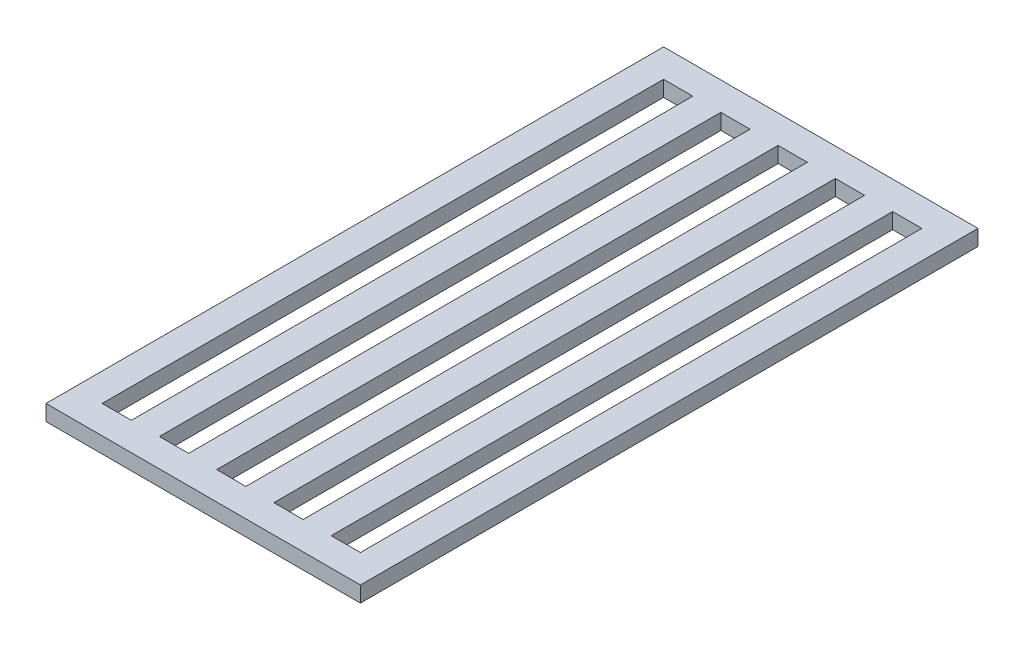
ISO-10303-21;
HEADER;
FILE_DESCRIPTION(('STEP AP214'),'2;1');
FILE_NAME('part.step','',(''),(''),'','','');
FILE_SCHEMA(('AUTOMOTIVE_DESIGN { 1 0 10303 214 1 1 1 1 }'));
ENDSEC;
DATA;
#1=APPLICATION_CONTEXT('core data for automotive mechanical design processes');
#2=APPLICATION_PROTOCOL_DEFINITION('international standard','automotive_design',2000,#1);
#3=PRODUCT_CONTEXT('',#1,'mechanical');
#4=PRODUCT('Part','Part','',(#3));
#5=PRODUCT_RELATED_PRODUCT_CATEGORY('part','',(#4));
#6=PRODUCT_DEFINITION_FORMATION('','',#4);
#7=PRODUCT_DEFINITION_CONTEXT('part definition',#1,'design');
#8=PRODUCT_DEFINITION('design','',#6,#7);
#9=PRODUCT_DEFINITION_SHAPE('','',#8);
#10=(LENGTH_UNIT() NAMED_UNIT(*) SI_UNIT(.MILLI.,.METRE.));
#11=(NAMED_UNIT(*) PLANE_ANGLE_UNIT() SI_UNIT($,.RADIAN.));
#12=(NAMED_UNIT(*) SI_UNIT($,.STERADIAN.) SOLID_ANGLE_UNIT());
#13=UNCERTAINTY_MEASURE_WITH_UNIT(LENGTH_MEASURE(1.E-05),#10,'distance_accuracy_value','');
#14=(GEOMETRIC_REPRESENTATION_CONTEXT(3) GLOBAL_UNCERTAINTY_ASSIGNED_CONTEXT((#13)) GLOBAL_UNIT_ASSIGNED_CONTEXT((#10,
#11,#12)) REPRESENTATION_CONTEXT('',''));
#15=CARTESIAN_POINT('',(0.,0.,0.));
#16=DIRECTION('',(0.,0.,1.));
#17=DIRECTION('',(1.,0.,0.));
#18=AXIS2_PLACEMENT_3D('',#15,#16,#17);
#19=CARTESIAN_POINT('',(0.,2.8,0.));
#20=DIRECTION('',(0.,-1.,0.));
#21=DIRECTION('',(0.,0.,-1.));
#22=AXIS2_PLACEMENT_3D('',#19,#20,#21);
#23=PLANE('',#22);
#24=DIRECTION('',(1.,0.,0.));
#25=VECTOR('',#24,1.);
#26=CARTESIAN_POINT('',(35.6,2.8,-5.));
#27=LINE('',#26,#25);
#28=CARTESIAN_POINT('',(35.6,2.8,-5.));
#29=VERTEX_POINT('',#28);
#30=CARTESIAN_POINT('',(40.8,2.8,-5.));
#31=VERTEX_POINT('',#30);
#32=EDGE_CURVE('E249',#29,#31,#27,.T.);
#33=ORIENTED_EDGE('',*,*,#32,.F.);
#34=DIRECTION('',(0.,0.,1.));
#35=VECTOR('',#34,1.);
#36=CARTESIAN_POINT('',(35.6,2.8,-5.));
#37=LINE('',#36,#35);
#38=CARTESIAN_POINT('',(35.6,2.8,-105.));
#39=VERTEX_POINT('',#38);
#40=EDGE_CURVE('E260',#39,#29,#37,.T.);
#41=ORIENTED_EDGE('',*,*,#40,.F.);
#42=DIRECTION('',(-1.,0.,0.));
#43=VECTOR('',#42,1.);
#44=CARTESIAN_POINT('',(35.6,2.8,-105.));
#45=LINE('',#44,#43);
#46=CARTESIAN_POINT('',(40.8,2.8,-105.));
#47=VERTEX_POINT('',#46);
#48=EDGE_CURVE('E256',#47,#39,#45,.T.);
#49=ORIENTED_EDGE('',*,*,#48,.F.);
#50=DIRECTION('',(0.,0.,-1.));
#51=VECTOR('',#50,1.);
#52=CARTESIAN_POINT('',(40.8,2.8,-5.));
#53=LINE('',#52,#51);
#54=EDGE_CURVE('E252',#31,#47,#53,.T.);
#55=ORIENTED_EDGE('',*,*,#54,.F.);
#56=EDGE_LOOP('',(#33,#41,#49,#55));
#57=FACE_BOUND('',#56,.T.);
#58=DIRECTION('',(1.,0.,0.));
#59=VECTOR('',#58,1.);
#60=CARTESIAN_POINT('',(15.2,2.8,-5.));
#61=LINE('',#60,#59);
#62=CARTESIAN_POINT('',(15.2,2.8,-5.));
#63=VERTEX_POINT('',#62);
#64=CARTESIAN_POINT('',(20.4,2.8,-5.));
#65=VERTEX_POINT('',#64);
#66=EDGE_CURVE('E335',#63,#65,#61,.T.);
#67=ORIENTED_EDGE('',*,*,#66,.F.);
#68=DIRECTION('',(0.,0.,1.));
#69=VECTOR('',#68,1.);
#70=CARTESIAN_POINT('',(15.2,2.8,-5.));
#71=LINE('',#70,#69);
#72=CARTESIAN_POINT('',(15.2,2.8,-105.));
#73=VERTEX_POINT('',#72);
#74=EDGE_CURVE('E346',#73,#63,#71,.T.);
#75=ORIENTED_EDGE('',*,*,#74,.F.);
#76=DIRECTION('',(-1.,0.,0.));
#77=VECTOR('',#76,1.);
#78=CARTESIAN_POINT('',(15.2,2.8,-105.));
#79=LINE('',#78,#77);
#80=CARTESIAN_POINT('',(20.4,2.8,-105.));
#81=VERTEX_POINT('',#80);
#82=EDGE_CURVE('E342',#81,#73,#79,.T.);
#83=ORIENTED_EDGE('',*,*,#82,.F.);
#84=DIRECTION('',(0.,0.,-1.));
#85=VECTOR('',#84,1.);
#86=CARTESIAN_POINT('',(20.4,2.8,-5.));
#87=LINE('',#86,#85);
#88=EDGE_CURVE('E338',#65,#81,#87,.T.);
#89=ORIENTED_EDGE('',*,*,#88,.F.);
#90=EDGE_LOOP('',(#67,#75,#83,#89));
#91=FACE_BOUND('',#90,.T.);
#92=DIRECTION('',(0.,0.,1.));
#93=VECTOR('',#92,1.);
#94=CARTESIAN_POINT('',(0.,2.8,0.));
#95=LINE('',#94,#93);
#96=CARTESIAN_POINT('',(0.,2.8,-110.));
#97=VERTEX_POINT('',#96);
#98=CARTESIAN_POINT('',(0.,2.8,0.));
#99=VERTEX_POINT('',#98);
#100=EDGE_CURVE('E421',#97,#99,#95,.T.);
#101=ORIENTED_EDGE('',*,*,#100,.T.);
#102=DIRECTION('',(1.,0.,0.));
#103=VECTOR('',#102,1.);
#104=CARTESIAN_POINT('',(0.,2.8,0.));
#105=LINE('',#104,#103);
#106=CARTESIAN_POINT('',(56.,2.8,0.));
#107=VERTEX_POINT('',#106);
#108=EDGE_CURVE('E425',#99,#107,#105,.T.);
#109=ORIENTED_EDGE('',*,*,#108,.T.);
#110=DIRECTION('',(0.,0.,-1.));
#111=VECTOR('',#110,1.);
#112=CARTESIAN_POINT('',(56.,2.8,0.));
#113=LINE('',#112,#111);
#114=CARTESIAN_POINT('',(56.,2.8,-110.));
#115=VERTEX_POINT('',#114);
#116=EDGE_CURVE('E429',#107,#115,#113,.T.);
#117=ORIENTED_EDGE('',*,*,#116,.T.);
#118=DIRECTION('',(-1.,0.,0.));
#119=VECTOR('',#118,1.);
#120=CARTESIAN_POINT('',(0.,2.8,-110.));
#121=LINE('',#120,#119);
#122=EDGE_CURVE('E432',#115,#97,#121,.T.);
#123=ORIENTED_EDGE('',*,*,#122,.T.);
#124=EDGE_LOOP('',(#101,#109,#117,#123));
#125=FACE_BOUND('',#124,.T.);
#126=DIRECTION('',(0.,0.,1.));
#127=VECTOR('',#126,1.);
#128=CARTESIAN_POINT('',(5.,2.8,-5.));
#129=LINE('',#128,#127);
#130=CARTESIAN_POINT('',(5.,2.8,-105.));
#131=VERTEX_POINT('',#130);
#132=CARTESIAN_POINT('',(5.,2.8,-5.));
#133=VERTEX_POINT('',#132);
#134=EDGE_CURVE('E378',#131,#133,#129,.T.);
#135=ORIENTED_EDGE('',*,*,#134,.F.);
#136=DIRECTION('',(-1.,0.,0.));
#137=VECTOR('',#136,1.);
#138=CARTESIAN_POINT('',(5.,2.8,-105.));
#139=LINE('',#138,#137);
#140=CARTESIAN_POINT('',(10.2,2.8,-105.));
#141=VERTEX_POINT('',#140);
#142=EDGE_CURVE('E389',#141,#131,#139,.T.);
#143=ORIENTED_EDGE('',*,*,#142,.F.);
#144=DIRECTION('',(0.,0.,-1.));
#145=VECTOR('',#144,1.);
#146=CARTESIAN_POINT('',(10.2,2.8,-5.));
#147=LINE('',#146,#145);
#148=CARTESIAN_POINT('',(10.2,2.8,-5.));
#149=VERTEX_POINT('',#148);
#150=EDGE_CURVE('E385',#149,#141,#147,.T.);
#151=ORIENTED_EDGE('',*,*,#150,.F.);
#152=DIRECTION('',(1.,0.,0.));
#153=VECTOR('',#152,1.);
#154=CARTESIAN_POINT('',(5.,2.8,-5.));
#155=LINE('',#154,#153);
#156=EDGE_CURVE('E381',#133,#149,#155,.T.);
#157=ORIENTED_EDGE('',*,*,#156,.F.);
#158=EDGE_LOOP('',(#135,#143,#151,#157));
#159=FACE_BOUND('',#158,.T.);
#160=DIRECTION('',(1.,0.,0.));
#161=VECTOR('',#160,1.);
#162=CARTESIAN_POINT('',(25.4,2.8,-5.));
#163=LINE('',#162,#161);
#164=CARTESIAN_POINT('',(25.4,2.8,-5.));
#165=VERTEX_POINT('',#164);
#166=CARTESIAN_POINT('',(30.6,2.8,-5.));
#167=VERTEX_POINT('',#166);
#168=EDGE_CURVE('E292',#165,#167,#163,.T.);
#169=ORIENTED_EDGE('',*,*,#168,.F.);
#170=DIRECTION('',(0.,0.,1.));
#171=VECTOR('',#170,1.);
#172=CARTESIAN_POINT('',(25.4,2.8,-5.));
#173=LINE('',#172,#171);
#174=CARTESIAN_POINT('',(25.4,2.8,-105.));
#175=VERTEX_POINT('',#174);
#176=EDGE_CURVE('E303',#175,#165,#173,.T.);
#177=ORIENTED_EDGE('',*,*,#176,.F.);
#178=DIRECTION('',(-1.,0.,0.));
#179=VECTOR('',#178,1.);
#180=CARTESIAN_POINT('',(25.4,2.8,-105.));
#181=LINE('',#180,#179);
#182=CARTESIAN_POINT('',(30.6,2.8,-105.));
#183=VERTEX_POINT('',#182);
#184=EDGE_CURVE('E299',#183,#175,#181,.T.);
#185=ORIENTED_EDGE('',*,*,#184,.F.);
#186=DIRECTION('',(0.,0.,-1.));
#187=VECTOR('',#186,1.);
#188=CARTESIAN_POINT('',(30.6,2.8,-5.));
#189=LINE('',#188,#187);
#190=EDGE_CURVE('E295',#167,#183,#189,.T.);
#191=ORIENTED_EDGE('',*,*,#190,.F.);
#192=EDGE_LOOP('',(#169,#177,#185,#191));
#193=FACE_BOUND('',#192,.T.);
#194=DIRECTION('',(1.,0.,0.));
#195=VECTOR('',#194,1.);
#196=CARTESIAN_POINT('',(45.8,2.8,-5.));
#197=LINE('',#196,#195);
#198=CARTESIAN_POINT('',(45.8,2.8,-5.));
#199=VERTEX_POINT('',#198);
#200=CARTESIAN_POINT('',(51.,2.8,-5.));
#201=VERTEX_POINT('',#200);
#202=EDGE_CURVE('E201',#199,#201,#197,.T.);
#203=ORIENTED_EDGE('',*,*,#202,.F.);
#204=DIRECTION('',(0.,0.,1.));
#205=VECTOR('',#204,1.);
#206=CARTESIAN_POINT('',(45.8,2.8,-5.));
#207=LINE('',#206,#205);
#208=CARTESIAN_POINT('',(45.8,2.8,-105.));
#209=VERTEX_POINT('',#208);
#210=EDGE_CURVE('E227',#209,#199,#207,.T.);
#211=ORIENTED_EDGE('',*,*,#210,.F.);
#212=DIRECTION('',(-1.,0.,0.));
#213=VECTOR('',#212,1.);
#214=CARTESIAN_POINT('',(45.8,2.8,-105.));
#215=LINE('',#214,#213);
#216=CARTESIAN_POINT('',(51.,2.8,-105.));
#217=VERTEX_POINT('',#216);
#218=EDGE_CURVE('E223',#217,#209,#215,.T.);
#219=ORIENTED_EDGE('',*,*,#218,.F.);
#220=DIRECTION('',(0.,0.,-1.));
#221=VECTOR('',#220,1.);
#222=CARTESIAN_POINT('',(51.,2.8,-5.));
#223=LINE('',#222,#221);
#224=EDGE_CURVE('E210',#201,#217,#223,.T.);
#225=ORIENTED_EDGE('',*,*,#224,.F.);
#226=EDGE_LOOP('',(#203,#211,#219,#225));
#227=FACE_BOUND('',#226,.T.);
#228=ADVANCED_FACE('F39',(#57,#91,#125,#159,#193,#227),#23,.F.);
#229=CARTESIAN_POINT('',(0.,0.,0.));
#230=DIRECTION('',(0.,-1.,0.));
#231=DIRECTION('',(0.,0.,-1.));
#232=AXIS2_PLACEMENT_3D('',#229,#230,#231);
#233=PLANE('',#232);
#234=DIRECTION('',(0.,0.,1.));
#235=VECTOR('',#234,1.);
#236=CARTESIAN_POINT('',(0.,0.,0.));
#237=LINE('',#236,#235);
#238=CARTESIAN_POINT('',(0.,0.,-110.));
#239=VERTEX_POINT('',#238);
#240=CARTESIAN_POINT('',(0.,0.,0.));
#241=VERTEX_POINT('',#240);
#242=EDGE_CURVE('E420',#239,#241,#237,.T.);
#243=ORIENTED_EDGE('',*,*,#242,.F.);
#244=DIRECTION('',(-1.,0.,0.));
#245=VECTOR('',#244,1.);
#246=CARTESIAN_POINT('',(0.,0.,-110.));
#247=LINE('',#246,#245);
#248=CARTESIAN_POINT('',(56.,0.,-110.));
#249=VERTEX_POINT('',#248);
#250=EDGE_CURVE('E426',#249,#239,#247,.T.);
#251=ORIENTED_EDGE('',*,*,#250,.F.);
#252=DIRECTION('',(0.,0.,-1.));
#253=VECTOR('',#252,1.);
#254=CARTESIAN_POINT('',(56.,0.,0.));
#255=LINE('',#254,#253);
#256=CARTESIAN_POINT('',(56.,0.,0.));
#257=VERTEX_POINT('',#256);
#258=EDGE_CURVE('E442',#257,#249,#255,.T.);
#259=ORIENTED_EDGE('',*,*,#258,.F.);
#260=DIRECTION('',(1.,0.,0.));
#261=VECTOR('',#260,1.);
#262=CARTESIAN_POINT('',(0.,0.,0.));
#263=LINE('',#262,#261);
#264=EDGE_CURVE('E439',#241,#257,#263,.T.);
#265=ORIENTED_EDGE('',*,*,#264,.F.);
#266=EDGE_LOOP('',(#243,#251,#259,#265));
#267=FACE_BOUND('',#266,.T.);
#268=DIRECTION('',(-1.,0.,0.));
#269=VECTOR('',#268,1.);
#270=CARTESIAN_POINT('',(5.,0.,-105.));
#271=LINE('',#270,#269);
#272=CARTESIAN_POINT('',(10.2,0.,-105.));
#273=VERTEX_POINT('',#272);
#274=CARTESIAN_POINT('',(5.,0.,-105.));
#275=VERTEX_POINT('',#274);
#276=EDGE_CURVE('E382',#273,#275,#271,.T.);
#277=ORIENTED_EDGE('',*,*,#276,.T.);
#278=DIRECTION('',(0.,0.,1.));
#279=VECTOR('',#278,1.);
#280=CARTESIAN_POINT('',(5.,0.,-5.));
#281=LINE('',#280,#279);
#282=CARTESIAN_POINT('',(5.,0.,-5.));
#283=VERTEX_POINT('',#282);
#284=EDGE_CURVE('E377',#275,#283,#281,.T.);
#285=ORIENTED_EDGE('',*,*,#284,.T.);
#286=DIRECTION('',(1.,0.,0.));
#287=VECTOR('',#286,1.);
#288=CARTESIAN_POINT('',(5.,0.,-5.));
#289=LINE('',#288,#287);
#290=CARTESIAN_POINT('',(10.2,0.,-5.));
#291=VERTEX_POINT('',#290);
#292=EDGE_CURVE('E396',#283,#291,#289,.T.);
#293=ORIENTED_EDGE('',*,*,#292,.T.);
#294=DIRECTION('',(0.,0.,-1.));
#295=VECTOR('',#294,1.);
#296=CARTESIAN_POINT('',(10.2,0.,-5.));
#297=LINE('',#296,#295);
#298=EDGE_CURVE('E400',#291,#273,#297,.T.);
#299=ORIENTED_EDGE('',*,*,#298,.T.);
#300=EDGE_LOOP('',(#277,#285,#293,#299));
#301=FACE_BOUND('',#300,.T.);
#302=DIRECTION('',(0.,0.,1.));
#303=VECTOR('',#302,1.);
#304=CARTESIAN_POINT('',(15.2,0.,-5.));
#305=LINE('',#304,#303);
#306=CARTESIAN_POINT('',(15.2,0.,-105.));
#307=VERTEX_POINT('',#306);
#308=CARTESIAN_POINT('',(15.2,0.,-5.));
#309=VERTEX_POINT('',#308);
#310=EDGE_CURVE('E339',#307,#309,#305,.T.);
#311=ORIENTED_EDGE('',*,*,#310,.T.);
#312=DIRECTION('',(1.,0.,0.));
#313=VECTOR('',#312,1.);
#314=CARTESIAN_POINT('',(15.2,0.,-5.));
#315=LINE('',#314,#313);
#316=CARTESIAN_POINT('',(20.4,0.,-5.));
#317=VERTEX_POINT('',#316);
#318=EDGE_CURVE('E334',#309,#317,#315,.T.);
#319=ORIENTED_EDGE('',*,*,#318,.T.);
#320=DIRECTION('',(0.,0.,-1.));
#321=VECTOR('',#320,1.);
#322=CARTESIAN_POINT('',(20.4,0.,-5.));
#323=LINE('',#322,#321);
#324=CARTESIAN_POINT('',(20.4,0.,-105.));
#325=VERTEX_POINT('',#324);
#326=EDGE_CURVE('E353',#317,#325,#323,.T.);
#327=ORIENTED_EDGE('',*,*,#326,.T.);
#328=DIRECTION('',(-1.,0.,0.));
#329=VECTOR('',#328,1.);
#330=CARTESIAN_POINT('',(15.2,0.,-105.));
#331=LINE('',#330,#329);
#332=EDGE_CURVE('E357',#325,#307,#331,.T.);
#333=ORIENTED_EDGE('',*,*,#332,.T.);
#334=EDGE_LOOP('',(#311,#319,#327,#333));
#335=FACE_BOUND('',#334,.T.);
#336=DIRECTION('',(0.,0.,1.));
#337=VECTOR('',#336,1.);
#338=CARTESIAN_POINT('',(25.4,0.,-5.));
#339=LINE('',#338,#337);
#340=CARTESIAN_POINT('',(25.4,0.,-105.));
#341=VERTEX_POINT('',#340);
#342=CARTESIAN_POINT('',(25.4,0.,-5.));
#343=VERTEX_POINT('',#342);
#344=EDGE_CURVE('E296',#341,#343,#339,.T.);
#345=ORIENTED_EDGE('',*,*,#344,.T.);
#346=DIRECTION('',(1.,0.,0.));
#347=VECTOR('',#346,1.);
#348=CARTESIAN_POINT('',(25.4,0.,-5.));
#349=LINE('',#348,#347);
#350=CARTESIAN_POINT('',(30.6,0.,-5.));
#351=VERTEX_POINT('',#350);
#352=EDGE_CURVE('E291',#343,#351,#349,.T.);
#353=ORIENTED_EDGE('',*,*,#352,.T.);
#354=DIRECTION('',(0.,0.,-1.));
#355=VECTOR('',#354,1.);
#356=CARTESIAN_POINT('',(30.6,0.,-5.));
#357=LINE('',#356,#355);
#358=CARTESIAN_POINT('',(30.6,0.,-105.));
#359=VERTEX_POINT('',#358);
#360=EDGE_CURVE('E310',#351,#359,#357,.T.);
#361=ORIENTED_EDGE('',*,*,#360,.T.);
#362=DIRECTION('',(-1.,0.,0.));
#363=VECTOR('',#362,1.);
#364=CARTESIAN_POINT('',(25.4,0.,-105.));
#365=LINE('',#364,#363);
#366=EDGE_CURVE('E314',#359,#341,#365,.T.);
#367=ORIENTED_EDGE('',*,*,#366,.T.);
#368=EDGE_LOOP('',(#345,#353,#361,#367));
#369=FACE_BOUND('',#368,.T.);
#370=DIRECTION('',(0.,0.,1.));
#371=VECTOR('',#370,1.);
#372=CARTESIAN_POINT('',(35.6,0.,-5.));
#373=LINE('',#372,#371);
#374=CARTESIAN_POINT('',(35.6,0.,-105.));
#375=VERTEX_POINT('',#374);
#376=CARTESIAN_POINT('',(35.6,0.,-5.));
#377=VERTEX_POINT('',#376);
#378=EDGE_CURVE('E253',#375,#377,#373,.T.);
#379=ORIENTED_EDGE('',*,*,#378,.T.);
#380=DIRECTION('',(1.,0.,0.));
#381=VECTOR('',#380,1.);
#382=CARTESIAN_POINT('',(35.6,0.,-5.));
#383=LINE('',#382,#381);
#384=CARTESIAN_POINT('',(40.8,0.,-5.));
#385=VERTEX_POINT('',#384);
#386=EDGE_CURVE('E219',#377,#385,#383,.T.);
#387=ORIENTED_EDGE('',*,*,#386,.T.);
#388=DIRECTION('',(0.,0.,-1.));
#389=VECTOR('',#388,1.);
#390=CARTESIAN_POINT('',(40.8,0.,-5.));
#391=LINE('',#390,#389);
#392=CARTESIAN_POINT('',(40.8,0.,-105.));
#393=VERTEX_POINT('',#392);
#394=EDGE_CURVE('E267',#385,#393,#391,.T.);
#395=ORIENTED_EDGE('',*,*,#394,.T.);
#396=DIRECTION('',(-1.,0.,0.));
#397=VECTOR('',#396,1.);
#398=CARTESIAN_POINT('',(35.6,0.,-105.));
#399=LINE('',#398,#397);
#400=EDGE_CURVE('E271',#393,#375,#399,.T.);
#401=ORIENTED_EDGE('',*,*,#400,.T.);
#402=EDGE_LOOP('',(#379,#387,#395,#401));
#403=FACE_BOUND('',#402,.T.);
#404=DIRECTION('',(0.,0.,1.));
#405=VECTOR('',#404,1.);
#406=CARTESIAN_POINT('',(45.8,0.,-5.));
#407=LINE('',#406,#405);
#408=CARTESIAN_POINT('',(45.8,0.,-105.));
#409=VERTEX_POINT('',#408);
#410=CARTESIAN_POINT('',(45.8,0.,-5.));
#411=VERTEX_POINT('',#410);
#412=EDGE_CURVE('E211',#409,#411,#407,.T.);
#413=ORIENTED_EDGE('',*,*,#412,.T.);
#414=DIRECTION('',(1.,0.,0.));
#415=VECTOR('',#414,1.);
#416=CARTESIAN_POINT('',(45.8,0.,-5.));
#417=LINE('',#416,#415);
#418=CARTESIAN_POINT('',(51.,0.,-5.));
#419=VERTEX_POINT('',#418);
#420=EDGE_CURVE('E63',#411,#419,#417,.T.);
#421=ORIENTED_EDGE('',*,*,#420,.T.);
#422=DIRECTION('',(0.,0.,-1.));
#423=VECTOR('',#422,1.);
#424=CARTESIAN_POINT('',(51.,0.,-5.));
#425=LINE('',#424,#423);
#426=CARTESIAN_POINT('',(51.,0.,-105.));
#427=VERTEX_POINT('',#426);
#428=EDGE_CURVE('E217',#419,#427,#425,.T.);
#429=ORIENTED_EDGE('',*,*,#428,.T.);
#430=DIRECTION('',(-1.,0.,0.));
#431=VECTOR('',#430,1.);
#432=CARTESIAN_POINT('',(45.8,0.,-105.));
#433=LINE('',#432,#431);
#434=EDGE_CURVE('E236',#427,#409,#433,.T.);
#435=ORIENTED_EDGE('',*,*,#434,.T.);
#436=EDGE_LOOP('',(#413,#421,#429,#435));
#437=FACE_BOUND('',#436,.T.);
#438=ADVANCED_FACE('F465',(#267,#301,#335,#369,#403,#437),#233,.T.);
#439=CARTESIAN_POINT('',(0.,2.8,0.));
#440=DIRECTION('',(1.,0.,0.));
#441=DIRECTION('',(0.,0.,-1.));
#442=AXIS2_PLACEMENT_3D('',#439,#440,#441);
#443=PLANE('',#442);
#444=ORIENTED_EDGE('',*,*,#242,.T.);
#445=DIRECTION('',(0.,-1.,0.));
#446=VECTOR('',#445,1.);
#447=CARTESIAN_POINT('',(0.,2.8,0.));
#448=LINE('',#447,#446);
#449=EDGE_CURVE('E11',#99,#241,#448,.T.);
#450=ORIENTED_EDGE('',*,*,#449,.F.);
#451=ORIENTED_EDGE('',*,*,#100,.F.);
#452=DIRECTION('',(0.,-1.,0.));
#453=VECTOR('',#452,1.);
#454=CARTESIAN_POINT('',(0.,2.8,-110.));
#455=LINE('',#454,#453);
#456=EDGE_CURVE('E435',#97,#239,#455,.T.);
#457=ORIENTED_EDGE('',*,*,#456,.T.);
#458=EDGE_LOOP('',(#444,#450,#451,#457));
#459=FACE_BOUND('',#458,.T.);
#460=ADVANCED_FACE('F41',(#459),#443,.F.);
#461=CARTESIAN_POINT('',(0.,2.8,0.));
#462=DIRECTION('',(0.,0.,-1.));
#463=DIRECTION('',(-1.,0.,0.));
#464=AXIS2_PLACEMENT_3D('',#461,#462,#463);
#465=PLANE('',#464);
#466=ORIENTED_EDGE('',*,*,#264,.T.);
#467=DIRECTION('',(0.,-1.,0.));
#468=VECTOR('',#467,1.);
#469=CARTESIAN_POINT('',(56.,2.8,0.));
#470=LINE('',#469,#468);
#471=EDGE_CURVE('E48',#107,#257,#470,.T.);
#472=ORIENTED_EDGE('',*,*,#471,.F.);
#473=ORIENTED_EDGE('',*,*,#108,.F.);
#474=ORIENTED_EDGE('',*,*,#449,.T.);
#475=EDGE_LOOP('',(#466,#472,#473,#474));
#476=FACE_BOUND('',#475,.T.);
#477=ADVANCED_FACE('F476',(#476),#465,.F.);
#478=CARTESIAN_POINT('',(56.,2.8,0.));
#479=DIRECTION('',(-1.,0.,0.));
#480=DIRECTION('',(0.,0.,1.));
#481=AXIS2_PLACEMENT_3D('',#478,#479,#480);
#482=PLANE('',#481);
#483=ORIENTED_EDGE('',*,*,#258,.T.);
#484=DIRECTION('',(0.,-1.,0.));
#485=VECTOR('',#484,1.);
#486=CARTESIAN_POINT('',(56.,2.8,-110.));
#487=LINE('',#486,#485);
#488=EDGE_CURVE('E450',#115,#249,#487,.T.);
#489=ORIENTED_EDGE('',*,*,#488,.F.);
#490=ORIENTED_EDGE('',*,*,#116,.F.);
#491=ORIENTED_EDGE('',*,*,#471,.T.);
#492=EDGE_LOOP('',(#483,#489,#490,#491));
#493=FACE_BOUND('',#492,.T.);
#494=ADVANCED_FACE('F459',(#493),#482,.F.);
#495=CARTESIAN_POINT('',(0.,2.8,-110.));
#496=DIRECTION('',(0.,0.,1.));
#497=DIRECTION('',(1.,0.,0.));
#498=AXIS2_PLACEMENT_3D('',#495,#496,#497);
#499=PLANE('',#498);
#500=ORIENTED_EDGE('',*,*,#250,.T.);
#501=ORIENTED_EDGE('',*,*,#456,.F.);
#502=ORIENTED_EDGE('',*,*,#122,.F.);
#503=ORIENTED_EDGE('',*,*,#488,.T.);
#504=EDGE_LOOP('',(#500,#501,#502,#503));
#505=FACE_BOUND('',#504,.T.);
#506=ADVANCED_FACE('F469',(#505),#499,.F.);
#507=CARTESIAN_POINT('',(5.,2.8,-5.));
#508=DIRECTION('',(1.,0.,0.));
#509=DIRECTION('',(0.,0.,-1.));
#510=AXIS2_PLACEMENT_3D('',#507,#508,#509);
#511=PLANE('',#510);
#512=ORIENTED_EDGE('',*,*,#284,.F.);
#513=DIRECTION('',(0.,-1.,0.));
#514=VECTOR('',#513,1.);
#515=CARTESIAN_POINT('',(5.,2.8,-105.));
#516=LINE('',#515,#514);
#517=EDGE_CURVE('E392',#131,#275,#516,.T.);
#518=ORIENTED_EDGE('',*,*,#517,.F.);
#519=ORIENTED_EDGE('',*,*,#134,.T.);
#520=DIRECTION('',(0.,-1.,0.));
#521=VECTOR('',#520,1.);
#522=CARTESIAN_POINT('',(5.,2.8,-5.));
#523=LINE('',#522,#521);
#524=EDGE_CURVE('E416',#133,#283,#523,.T.);
#525=ORIENTED_EDGE('',*,*,#524,.T.);
#526=EDGE_LOOP('',(#512,#518,#519,#525));
#527=FACE_BOUND('',#526,.T.);
#528=ADVANCED_FACE('F493',(#527),#511,.T.);
#529=CARTESIAN_POINT('',(5.,2.8,-5.));
#530=DIRECTION('',(0.,0.,-1.));
#531=DIRECTION('',(-1.,0.,0.));
#532=AXIS2_PLACEMENT_3D('',#529,#530,#531);
#533=PLANE('',#532);
#534=ORIENTED_EDGE('',*,*,#292,.F.);
#535=ORIENTED_EDGE('',*,*,#524,.F.);
#536=ORIENTED_EDGE('',*,*,#156,.T.);
#537=DIRECTION('',(0.,-1.,0.));
#538=VECTOR('',#537,1.);
#539=CARTESIAN_POINT('',(10.2,2.8,-5.));
#540=LINE('',#539,#538);
#541=EDGE_CURVE('E413',#149,#291,#540,.T.);
#542=ORIENTED_EDGE('',*,*,#541,.T.);
#543=EDGE_LOOP('',(#534,#535,#536,#542));
#544=FACE_BOUND('',#543,.T.);
#545=ADVANCED_FACE('F500',(#544),#533,.T.);
#546=CARTESIAN_POINT('',(10.2,2.8,-5.));
#547=DIRECTION('',(-1.,0.,0.));
#548=DIRECTION('',(0.,0.,1.));
#549=AXIS2_PLACEMENT_3D('',#546,#547,#548);
#550=PLANE('',#549);
#551=ORIENTED_EDGE('',*,*,#298,.F.);
#552=ORIENTED_EDGE('',*,*,#541,.F.);
#553=ORIENTED_EDGE('',*,*,#150,.T.);
#554=DIRECTION('',(0.,-1.,0.));
#555=VECTOR('',#554,1.);
#556=CARTESIAN_POINT('',(10.2,2.8,-105.));
#557=LINE('',#556,#555);
#558=EDGE_CURVE('E410',#141,#273,#557,.T.);
#559=ORIENTED_EDGE('',*,*,#558,.T.);
#560=EDGE_LOOP('',(#551,#552,#553,#559));
#561=FACE_BOUND('',#560,.T.);
#562=ADVANCED_FACE('F505',(#561),#550,.T.);
#563=CARTESIAN_POINT('',(5.,2.8,-105.));
#564=DIRECTION('',(0.,0.,1.));
#565=DIRECTION('',(1.,0.,0.));
#566=AXIS2_PLACEMENT_3D('',#563,#564,#565);
#567=PLANE('',#566);
#568=ORIENTED_EDGE('',*,*,#276,.F.);
#569=ORIENTED_EDGE('',*,*,#558,.F.);
#570=ORIENTED_EDGE('',*,*,#142,.T.);
#571=ORIENTED_EDGE('',*,*,#517,.T.);
#572=EDGE_LOOP('',(#568,#569,#570,#571));
#573=FACE_BOUND('',#572,.T.);
#574=ADVANCED_FACE('F512',(#573),#567,.T.);
#575=CARTESIAN_POINT('',(15.2,2.8,-5.));
#576=DIRECTION('',(0.,0.,-1.));
#577=DIRECTION('',(-1.,0.,0.));
#578=AXIS2_PLACEMENT_3D('',#575,#576,#577);
#579=PLANE('',#578);
#580=ORIENTED_EDGE('',*,*,#318,.F.);
#581=DIRECTION('',(0.,-1.,0.));
#582=VECTOR('',#581,1.);
#583=CARTESIAN_POINT('',(15.2,2.8,-5.));
#584=LINE('',#583,#582);
#585=EDGE_CURVE('E349',#63,#309,#584,.T.);
#586=ORIENTED_EDGE('',*,*,#585,.F.);
#587=ORIENTED_EDGE('',*,*,#66,.T.);
#588=DIRECTION('',(0.,-1.,0.));
#589=VECTOR('',#588,1.);
#590=CARTESIAN_POINT('',(20.4,2.8,-5.));
#591=LINE('',#590,#589);
#592=EDGE_CURVE('E373',#65,#317,#591,.T.);
#593=ORIENTED_EDGE('',*,*,#592,.T.);
#594=EDGE_LOOP('',(#580,#586,#587,#593));
#595=FACE_BOUND('',#594,.T.);
#596=ADVANCED_FACE('F564',(#595),#579,.T.);
#597=CARTESIAN_POINT('',(20.4,2.8,-5.));
#598=DIRECTION('',(-1.,0.,0.));
#599=DIRECTION('',(0.,0.,1.));
#600=AXIS2_PLACEMENT_3D('',#597,#598,#599);
#601=PLANE('',#600);
#602=ORIENTED_EDGE('',*,*,#326,.F.);
#603=ORIENTED_EDGE('',*,*,#592,.F.);
#604=ORIENTED_EDGE('',*,*,#88,.T.);
#605=DIRECTION('',(0.,-1.,0.));
#606=VECTOR('',#605,1.);
#607=CARTESIAN_POINT('',(20.4,2.8,-105.));
#608=LINE('',#607,#606);
#609=EDGE_CURVE('E370',#81,#325,#608,.T.);
#610=ORIENTED_EDGE('',*,*,#609,.T.);
#611=EDGE_LOOP('',(#602,#603,#604,#610));
#612=FACE_BOUND('',#611,.T.);
#613=ADVANCED_FACE('F560',(#612),#601,.T.);
#614=CARTESIAN_POINT('',(15.2,2.8,-105.));
#615=DIRECTION('',(0.,0.,1.));
#616=DIRECTION('',(1.,0.,0.));
#617=AXIS2_PLACEMENT_3D('',#614,#615,#616);
#618=PLANE('',#617);
#619=ORIENTED_EDGE('',*,*,#332,.F.);
#620=ORIENTED_EDGE('',*,*,#609,.F.);
#621=ORIENTED_EDGE('',*,*,#82,.T.);
#622=DIRECTION('',(0.,-1.,0.));
#623=VECTOR('',#622,1.);
#624=CARTESIAN_POINT('',(15.2,2.8,-105.));
#625=LINE('',#624,#623);
#626=EDGE_CURVE('E367',#73,#307,#625,.T.);
#627=ORIENTED_EDGE('',*,*,#626,.T.);
#628=EDGE_LOOP('',(#619,#620,#621,#627));
#629=FACE_BOUND('',#628,.T.);
#630=ADVANCED_FACE('F556',(#629),#618,.T.);
#631=CARTESIAN_POINT('',(15.2,2.8,-5.));
#632=DIRECTION('',(1.,0.,0.));
#633=DIRECTION('',(0.,0.,-1.));
#634=AXIS2_PLACEMENT_3D('',#631,#632,#633);
#635=PLANE('',#634);
#636=ORIENTED_EDGE('',*,*,#310,.F.);
#637=ORIENTED_EDGE('',*,*,#626,.F.);
#638=ORIENTED_EDGE('',*,*,#74,.T.);
#639=ORIENTED_EDGE('',*,*,#585,.T.);
#640=EDGE_LOOP('',(#636,#637,#638,#639));
#641=FACE_BOUND('',#640,.T.);
#642=ADVANCED_FACE('F553',(#641),#635,.T.);
#643=CARTESIAN_POINT('',(25.4,2.8,-5.));
#644=DIRECTION('',(0.,0.,-1.));
#645=DIRECTION('',(-1.,0.,0.));
#646=AXIS2_PLACEMENT_3D('',#643,#644,#645);
#647=PLANE('',#646);
#648=ORIENTED_EDGE('',*,*,#352,.F.);
#649=DIRECTION('',(0.,-1.,0.));
#650=VECTOR('',#649,1.);
#651=CARTESIAN_POINT('',(25.4,2.8,-5.));
#652=LINE('',#651,#650);
#653=EDGE_CURVE('E306',#165,#343,#652,.T.);
#654=ORIENTED_EDGE('',*,*,#653,.F.);
#655=ORIENTED_EDGE('',*,*,#168,.T.);
#656=DIRECTION('',(0.,-1.,0.));
#657=VECTOR('',#656,1.);
#658=CARTESIAN_POINT('',(30.6,2.8,-5.));
#659=LINE('',#658,#657);
#660=EDGE_CURVE('E330',#167,#351,#659,.T.);
#661=ORIENTED_EDGE('',*,*,#660,.T.);
#662=EDGE_LOOP('',(#648,#654,#655,#661));
#663=FACE_BOUND('',#662,.T.);
#664=ADVANCED_FACE('F528',(#663),#647,.T.);
#665=CARTESIAN_POINT('',(30.6,2.8,-5.));
#666=DIRECTION('',(-1.,0.,0.));
#667=DIRECTION('',(0.,0.,1.));
#668=AXIS2_PLACEMENT_3D('',#665,#666,#667);
#669=PLANE('',#668);
#670=ORIENTED_EDGE('',*,*,#360,.F.);
#671=ORIENTED_EDGE('',*,*,#660,.F.);
#672=ORIENTED_EDGE('',*,*,#190,.T.);
#673=DIRECTION('',(0.,-1.,0.));
#674=VECTOR('',#673,1.);
#675=CARTESIAN_POINT('',(30.6,2.8,-105.));
#676=LINE('',#675,#674);
#677=EDGE_CURVE('E327',#183,#359,#676,.T.);
#678=ORIENTED_EDGE('',*,*,#677,.T.);
#679=EDGE_LOOP('',(#670,#671,#672,#678));
#680=FACE_BOUND('',#679,.T.);
#681=ADVANCED_FACE('F530',(#680),#669,.T.);
#682=CARTESIAN_POINT('',(25.4,2.8,-105.));
#683=DIRECTION('',(0.,0.,1.));
#684=DIRECTION('',(1.,0.,0.));
#685=AXIS2_PLACEMENT_3D('',#682,#683,#684);
#686=PLANE('',#685);
#687=ORIENTED_EDGE('',*,*,#366,.F.);
#688=ORIENTED_EDGE('',*,*,#677,.F.);
#689=ORIENTED_EDGE('',*,*,#184,.T.);
#690=DIRECTION('',(0.,-1.,0.));
#691=VECTOR('',#690,1.);
#692=CARTESIAN_POINT('',(25.4,2.8,-105.));
#693=LINE('',#692,#691);
#694=EDGE_CURVE('E324',#175,#341,#693,.T.);
#695=ORIENTED_EDGE('',*,*,#694,.T.);
#696=EDGE_LOOP('',(#687,#688,#689,#695));
#697=FACE_BOUND('',#696,.T.);
#698=ADVANCED_FACE('F539',(#697),#686,.T.);
#699=CARTESIAN_POINT('',(25.4,2.8,-5.));
#700=DIRECTION('',(1.,0.,0.));
#701=DIRECTION('',(0.,0.,-1.));
#702=AXIS2_PLACEMENT_3D('',#699,#700,#701);
#703=PLANE('',#702);
#704=ORIENTED_EDGE('',*,*,#344,.F.);
#705=ORIENTED_EDGE('',*,*,#694,.F.);
#706=ORIENTED_EDGE('',*,*,#176,.T.);
#707=ORIENTED_EDGE('',*,*,#653,.T.);
#708=EDGE_LOOP('',(#704,#705,#706,#707));
#709=FACE_BOUND('',#708,.T.);
#710=ADVANCED_FACE('F537',(#709),#703,.T.);
#711=CARTESIAN_POINT('',(35.6,2.8,-5.));
#712=DIRECTION('',(0.,0.,-1.));
#713=DIRECTION('',(-1.,0.,0.));
#714=AXIS2_PLACEMENT_3D('',#711,#712,#713);
#715=PLANE('',#714);
#716=ORIENTED_EDGE('',*,*,#386,.F.);
#717=DIRECTION('',(0.,-1.,0.));
#718=VECTOR('',#717,1.);
#719=CARTESIAN_POINT('',(35.6,2.8,-5.));
#720=LINE('',#719,#718);
#721=EDGE_CURVE('E263',#29,#377,#720,.T.);
#722=ORIENTED_EDGE('',*,*,#721,.F.);
#723=ORIENTED_EDGE('',*,*,#32,.T.);
#724=DIRECTION('',(0.,-1.,0.));
#725=VECTOR('',#724,1.);
#726=CARTESIAN_POINT('',(40.8,2.8,-5.));
#727=LINE('',#726,#725);
#728=EDGE_CURVE('E287',#31,#385,#727,.T.);
#729=ORIENTED_EDGE('',*,*,#728,.T.);
#730=EDGE_LOOP('',(#716,#722,#723,#729));
#731=FACE_BOUND('',#730,.T.);
#732=ADVANCED_FACE('F546',(#731),#715,.T.);
#733=CARTESIAN_POINT('',(40.8,2.8,-5.));
#734=DIRECTION('',(-1.,0.,0.));
#735=DIRECTION('',(0.,0.,1.));
#736=AXIS2_PLACEMENT_3D('',#733,#734,#735);
#737=PLANE('',#736);
#738=ORIENTED_EDGE('',*,*,#394,.F.);
#739=ORIENTED_EDGE('',*,*,#728,.F.);
#740=ORIENTED_EDGE('',*,*,#54,.T.);
#741=DIRECTION('',(0.,-1.,0.));
#742=VECTOR('',#741,1.);
#743=CARTESIAN_POINT('',(40.8,2.8,-105.));
#744=LINE('',#743,#742);
#745=EDGE_CURVE('E284',#47,#393,#744,.T.);
#746=ORIENTED_EDGE('',*,*,#745,.T.);
#747=EDGE_LOOP('',(#738,#739,#740,#746));
#748=FACE_BOUND('',#747,.T.);
#749=ADVANCED_FACE('F623',(#748),#737,.T.);
#750=CARTESIAN_POINT('',(35.6,2.8,-105.));
#751=DIRECTION('',(0.,0.,1.));
#752=DIRECTION('',(1.,0.,0.));
#753=AXIS2_PLACEMENT_3D('',#750,#751,#752);
#754=PLANE('',#753);
#755=ORIENTED_EDGE('',*,*,#400,.F.);
#756=ORIENTED_EDGE('',*,*,#745,.F.);
#757=ORIENTED_EDGE('',*,*,#48,.T.);
#758=DIRECTION('',(0.,-1.,0.));
#759=VECTOR('',#758,1.);
#760=CARTESIAN_POINT('',(35.6,2.8,-105.));
#761=LINE('',#760,#759);
#762=EDGE_CURVE('E281',#39,#375,#761,.T.);
#763=ORIENTED_EDGE('',*,*,#762,.T.);
#764=EDGE_LOOP('',(#755,#756,#757,#763));
#765=FACE_BOUND('',#764,.T.);
#766=ADVANCED_FACE('F632',(#765),#754,.T.);
#767=CARTESIAN_POINT('',(35.6,2.8,-5.));
#768=DIRECTION('',(1.,0.,0.));
#769=DIRECTION('',(0.,0.,-1.));
#770=AXIS2_PLACEMENT_3D('',#767,#768,#769);
#771=PLANE('',#770);
#772=ORIENTED_EDGE('',*,*,#378,.F.);
#773=ORIENTED_EDGE('',*,*,#762,.F.);
#774=ORIENTED_EDGE('',*,*,#40,.T.);
#775=ORIENTED_EDGE('',*,*,#721,.T.);
#776=EDGE_LOOP('',(#772,#773,#774,#775));
#777=FACE_BOUND('',#776,.T.);
#778=ADVANCED_FACE('F642',(#777),#771,.T.);
#779=CARTESIAN_POINT('',(45.8,2.8,-5.));
#780=DIRECTION('',(0.,0.,-1.));
#781=DIRECTION('',(-1.,0.,0.));
#782=AXIS2_PLACEMENT_3D('',#779,#780,#781);
#783=PLANE('',#782);
#784=ORIENTED_EDGE('',*,*,#420,.F.);
#785=DIRECTION('',(0.,-1.,0.));
#786=VECTOR('',#785,1.);
#787=CARTESIAN_POINT('',(45.8,2.8,-5.));
#788=LINE('',#787,#786);
#789=EDGE_CURVE('E205',#199,#411,#788,.T.);
#790=ORIENTED_EDGE('',*,*,#789,.F.);
#791=ORIENTED_EDGE('',*,*,#202,.T.);
#792=DIRECTION('',(0.,-1.,0.));
#793=VECTOR('',#792,1.);
#794=CARTESIAN_POINT('',(51.,2.8,-5.));
#795=LINE('',#794,#793);
#796=EDGE_CURVE('E204',#201,#419,#795,.T.);
#797=ORIENTED_EDGE('',*,*,#796,.T.);
#798=EDGE_LOOP('',(#784,#790,#791,#797));
#799=FACE_BOUND('',#798,.T.);
#800=ADVANCED_FACE('F203',(#799),#783,.T.);
#801=CARTESIAN_POINT('',(51.,2.8,-5.));
#802=DIRECTION('',(-1.,0.,0.));
#803=DIRECTION('',(0.,0.,1.));
#804=AXIS2_PLACEMENT_3D('',#801,#802,#803);
#805=PLANE('',#804);
#806=ORIENTED_EDGE('',*,*,#428,.F.);
#807=ORIENTED_EDGE('',*,*,#796,.F.);
#808=ORIENTED_EDGE('',*,*,#224,.T.);
#809=DIRECTION('',(0.,-1.,0.));
#810=VECTOR('',#809,1.);
#811=CARTESIAN_POINT('',(51.,2.8,-105.));
#812=LINE('',#811,#810);
#813=EDGE_CURVE('E220',#217,#427,#812,.T.);
#814=ORIENTED_EDGE('',*,*,#813,.T.);
#815=EDGE_LOOP('',(#806,#807,#808,#814));
#816=FACE_BOUND('',#815,.T.);
#817=ADVANCED_FACE('F214',(#816),#805,.T.);
#818=CARTESIAN_POINT('',(45.8,2.8,-105.));
#819=DIRECTION('',(0.,0.,1.));
#820=DIRECTION('',(1.,0.,0.));
#821=AXIS2_PLACEMENT_3D('',#818,#819,#820);
#822=PLANE('',#821);
#823=ORIENTED_EDGE('',*,*,#434,.F.);
#824=ORIENTED_EDGE('',*,*,#813,.F.);
#825=ORIENTED_EDGE('',*,*,#218,.T.);
#826=DIRECTION('',(0.,-1.,0.));
#827=VECTOR('',#826,1.);
#828=CARTESIAN_POINT('',(45.8,2.8,-105.));
#829=LINE('',#828,#827);
#830=EDGE_CURVE('E55',#209,#409,#829,.T.);
#831=ORIENTED_EDGE('',*,*,#830,.T.);
#832=EDGE_LOOP('',(#823,#824,#825,#831));
#833=FACE_BOUND('',#832,.T.);
#834=ADVANCED_FACE('F669',(#833),#822,.T.);
#835=CARTESIAN_POINT('',(45.8,2.8,-5.));
#836=DIRECTION('',(1.,0.,0.));
#837=DIRECTION('',(0.,0.,-1.));
#838=AXIS2_PLACEMENT_3D('',#835,#836,#837);
#839=PLANE('',#838);
#840=ORIENTED_EDGE('',*,*,#412,.F.);
#841=ORIENTED_EDGE('',*,*,#830,.F.);
#842=ORIENTED_EDGE('',*,*,#210,.T.);
#843=ORIENTED_EDGE('',*,*,#789,.T.);
#844=EDGE_LOOP('',(#840,#841,#842,#843));
#845=FACE_BOUND('',#844,.T.);
#846=ADVANCED_FACE('F678',(#845),#839,.T.);
#847=CLOSED_SHELL('',(#228,#438,#460,#477,#494,#506,#528,#545,#562,#574,#596,#613,#630,#642,
#664,#681,#698,#710,#732,#749,#766,#778,#800,#817,#834,#846));
#848=MANIFOLD_SOLID_BREP('B2',#847);
#849=ADVANCED_BREP_SHAPE_REPRESENTATION('',(#18,#848),#14);
#850=SHAPE_DEFINITION_REPRESENTATION(#9,#849);
ENDSEC;
END-ISO-10303-21;
